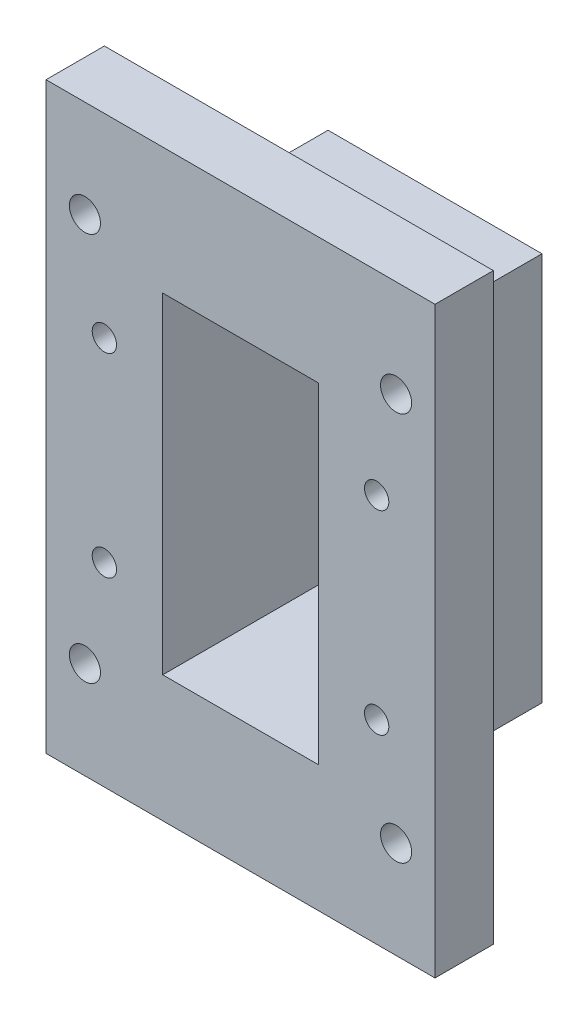
ISO-10303-21;
HEADER;
FILE_DESCRIPTION(('STEP AP214'),'2;1');
FILE_NAME('part.step','',(''),(''),'','','');
FILE_SCHEMA(('AUTOMOTIVE_DESIGN { 1 0 10303 214 1 1 1 1 }'));
ENDSEC;
DATA;
#1=APPLICATION_CONTEXT('core data for automotive mechanical design processes');
#2=APPLICATION_PROTOCOL_DEFINITION('international standard','automotive_design',2000,#1);
#3=PRODUCT_CONTEXT('',#1,'mechanical');
#4=PRODUCT('Part','Part','',(#3));
#5=PRODUCT_RELATED_PRODUCT_CATEGORY('part','',(#4));
#6=PRODUCT_DEFINITION_FORMATION('','',#4);
#7=PRODUCT_DEFINITION_CONTEXT('part definition',#1,'design');
#8=PRODUCT_DEFINITION('design','',#6,#7);
#9=PRODUCT_DEFINITION_SHAPE('','',#8);
#10=(LENGTH_UNIT() NAMED_UNIT(*) SI_UNIT(.MILLI.,.METRE.));
#11=(NAMED_UNIT(*) PLANE_ANGLE_UNIT() SI_UNIT($,.RADIAN.));
#12=(NAMED_UNIT(*) SI_UNIT($,.STERADIAN.) SOLID_ANGLE_UNIT());
#13=UNCERTAINTY_MEASURE_WITH_UNIT(LENGTH_MEASURE(1.E-05),#10,'distance_accuracy_value','');
#14=(GEOMETRIC_REPRESENTATION_CONTEXT(3) GLOBAL_UNCERTAINTY_ASSIGNED_CONTEXT((#13)) GLOBAL_UNIT_ASSIGNED_CONTEXT((#10,
#11,#12)) REPRESENTATION_CONTEXT('',''));
#15=CARTESIAN_POINT('',(0.,0.,0.));
#16=DIRECTION('',(0.,0.,1.));
#17=DIRECTION('',(1.,0.,0.));
#18=AXIS2_PLACEMENT_3D('',#15,#16,#17);
#19=CARTESIAN_POINT('',(0.,0.,6.));
#20=DIRECTION('',(0.,0.,-1.));
#21=DIRECTION('',(-1.,0.,0.));
#22=AXIS2_PLACEMENT_3D('',#19,#20,#21);
#23=PLANE('',#22);
#24=CARTESIAN_POINT('',(6.00000000000001,20.,6.));
#25=DIRECTION('',(0.,0.,1.));
#26=DIRECTION('',(1.,0.,0.));
#27=AXIS2_PLACEMENT_3D('',#24,#25,#26);
#28=CIRCLE('',#27,1.25);
#29=CARTESIAN_POINT('',(7.25000000000001,20.,6.));
#30=VERTEX_POINT('',#29);
#31=EDGE_CURVE('E406',#30,#30,#28,.T.);
#32=ORIENTED_EDGE('',*,*,#31,.F.);
#33=EDGE_LOOP('',(#32));
#34=FACE_BOUND('',#33,.T.);
#35=CARTESIAN_POINT('',(34.,20.,6.));
#36=DIRECTION('',(0.,0.,1.));
#37=DIRECTION('',(1.,0.,0.));
#38=AXIS2_PLACEMENT_3D('',#35,#36,#37);
#39=CIRCLE('',#38,1.25);
#40=CARTESIAN_POINT('',(35.25,20.,6.));
#41=VERTEX_POINT('',#40);
#42=EDGE_CURVE('E418',#41,#41,#39,.T.);
#43=ORIENTED_EDGE('',*,*,#42,.F.);
#44=EDGE_LOOP('',(#43));
#45=FACE_BOUND('',#44,.T.);
#46=DIRECTION('',(0.,-1.,0.));
#47=VECTOR('',#46,1.);
#48=CARTESIAN_POINT('',(0.,0.,6.));
#49=LINE('',#48,#47);
#50=CARTESIAN_POINT('',(0.,60.,6.));
#51=VERTEX_POINT('',#50);
#52=CARTESIAN_POINT('',(0.,0.,6.));
#53=VERTEX_POINT('',#52);
#54=EDGE_CURVE('E276',#51,#53,#49,.T.);
#55=ORIENTED_EDGE('',*,*,#54,.T.);
#56=DIRECTION('',(1.,0.,0.));
#57=VECTOR('',#56,1.);
#58=CARTESIAN_POINT('',(0.,0.,6.));
#59=LINE('',#58,#57);
#60=CARTESIAN_POINT('',(40.,0.,6.));
#61=VERTEX_POINT('',#60);
#62=EDGE_CURVE('E97',#53,#61,#59,.T.);
#63=ORIENTED_EDGE('',*,*,#62,.T.);
#64=DIRECTION('',(0.,1.,0.));
#65=VECTOR('',#64,1.);
#66=CARTESIAN_POINT('',(40.,0.,6.));
#67=LINE('',#66,#65);
#68=CARTESIAN_POINT('',(40.,60.,6.));
#69=VERTEX_POINT('',#68);
#70=EDGE_CURVE('E281',#61,#69,#67,.T.);
#71=ORIENTED_EDGE('',*,*,#70,.T.);
#72=DIRECTION('',(-1.,0.,0.));
#73=VECTOR('',#72,1.);
#74=CARTESIAN_POINT('',(0.,60.,6.));
#75=LINE('',#74,#73);
#76=EDGE_CURVE('E69',#69,#51,#75,.T.);
#77=ORIENTED_EDGE('',*,*,#76,.T.);
#78=EDGE_LOOP('',(#55,#63,#71,#77));
#79=FACE_BOUND('',#78,.T.);
#80=CARTESIAN_POINT('',(4.00000000000042,10.,6.));
#81=DIRECTION('',(0.,0.,1.));
#82=DIRECTION('',(1.,0.,0.));
#83=AXIS2_PLACEMENT_3D('',#80,#81,#82);
#84=CIRCLE('',#83,1.6);
#85=CARTESIAN_POINT('',(5.60000000000042,10.,6.));
#86=VERTEX_POINT('',#85);
#87=EDGE_CURVE('E267',#86,#86,#84,.T.);
#88=ORIENTED_EDGE('',*,*,#87,.F.);
#89=EDGE_LOOP('',(#88));
#90=FACE_BOUND('',#89,.T.);
#91=CARTESIAN_POINT('',(36.000000000001,10.,6.));
#92=DIRECTION('',(0.,0.,1.));
#93=DIRECTION('',(1.,0.,0.));
#94=AXIS2_PLACEMENT_3D('',#91,#92,#93);
#95=CIRCLE('',#94,1.6);
#96=CARTESIAN_POINT('',(37.600000000001,10.,6.));
#97=VERTEX_POINT('',#96);
#98=EDGE_CURVE('E259',#97,#97,#95,.T.);
#99=ORIENTED_EDGE('',*,*,#98,.F.);
#100=EDGE_LOOP('',(#99));
#101=FACE_BOUND('',#100,.T.);
#102=CARTESIAN_POINT('',(36.,50.,6.));
#103=DIRECTION('',(0.,0.,1.));
#104=DIRECTION('',(1.,0.,0.));
#105=AXIS2_PLACEMENT_3D('',#102,#103,#104);
#106=CIRCLE('',#105,1.6);
#107=CARTESIAN_POINT('',(37.6,50.,6.));
#108=VERTEX_POINT('',#107);
#109=EDGE_CURVE('E251',#108,#108,#106,.T.);
#110=ORIENTED_EDGE('',*,*,#109,.F.);
#111=EDGE_LOOP('',(#110));
#112=FACE_BOUND('',#111,.T.);
#113=CARTESIAN_POINT('',(4.,50.,6.));
#114=DIRECTION('',(0.,0.,1.));
#115=DIRECTION('',(1.,0.,0.));
#116=AXIS2_PLACEMENT_3D('',#113,#114,#115);
#117=CIRCLE('',#116,1.6);
#118=CARTESIAN_POINT('',(5.6,50.,6.));
#119=VERTEX_POINT('',#118);
#120=EDGE_CURVE('E243',#119,#119,#117,.T.);
#121=ORIENTED_EDGE('',*,*,#120,.F.);
#122=EDGE_LOOP('',(#121));
#123=FACE_BOUND('',#122,.T.);
#124=DIRECTION('',(-1.,0.,0.));
#125=VECTOR('',#124,1.);
#126=CARTESIAN_POINT('',(12.,13.,6.));
#127=LINE('',#126,#125);
#128=CARTESIAN_POINT('',(28.,13.,6.));
#129=VERTEX_POINT('',#128);
#130=CARTESIAN_POINT('',(12.,13.,6.));
#131=VERTEX_POINT('',#130);
#132=EDGE_CURVE('E157',#129,#131,#127,.T.);
#133=ORIENTED_EDGE('',*,*,#132,.T.);
#134=DIRECTION('',(0.,1.,0.));
#135=VECTOR('',#134,1.);
#136=CARTESIAN_POINT('',(12.,47.,6.));
#137=LINE('',#136,#135);
#138=CARTESIAN_POINT('',(12.,47.,6.));
#139=VERTEX_POINT('',#138);
#140=EDGE_CURVE('E181',#131,#139,#137,.T.);
#141=ORIENTED_EDGE('',*,*,#140,.T.);
#142=DIRECTION('',(1.,0.,0.));
#143=VECTOR('',#142,1.);
#144=CARTESIAN_POINT('',(28.,47.,6.));
#145=LINE('',#144,#143);
#146=CARTESIAN_POINT('',(28.,47.,6.));
#147=VERTEX_POINT('',#146);
#148=EDGE_CURVE('E163',#139,#147,#145,.T.);
#149=ORIENTED_EDGE('',*,*,#148,.T.);
#150=DIRECTION('',(0.,-1.,0.));
#151=VECTOR('',#150,1.);
#152=CARTESIAN_POINT('',(28.,13.,6.));
#153=LINE('',#152,#151);
#154=EDGE_CURVE('E187',#147,#129,#153,.T.);
#155=ORIENTED_EDGE('',*,*,#154,.T.);
#156=EDGE_LOOP('',(#133,#141,#149,#155));
#157=FACE_BOUND('',#156,.T.);
#158=CARTESIAN_POINT('',(34.,40.,6.));
#159=DIRECTION('',(0.,0.,1.));
#160=DIRECTION('',(1.,0.,0.));
#161=AXIS2_PLACEMENT_3D('',#158,#159,#160);
#162=CIRCLE('',#161,1.25);
#163=CARTESIAN_POINT('',(35.25,40.,6.));
#164=VERTEX_POINT('',#163);
#165=EDGE_CURVE('E426',#164,#164,#162,.T.);
#166=ORIENTED_EDGE('',*,*,#165,.F.);
#167=EDGE_LOOP('',(#166));
#168=FACE_BOUND('',#167,.T.);
#169=CARTESIAN_POINT('',(6.,40.,6.));
#170=DIRECTION('',(0.,0.,1.));
#171=DIRECTION('',(1.,0.,0.));
#172=AXIS2_PLACEMENT_3D('',#169,#170,#171);
#173=CIRCLE('',#172,1.25);
#174=CARTESIAN_POINT('',(7.25,40.,6.));
#175=VERTEX_POINT('',#174);
#176=EDGE_CURVE('E401',#175,#175,#173,.T.);
#177=ORIENTED_EDGE('',*,*,#176,.F.);
#178=EDGE_LOOP('',(#177));
#179=FACE_BOUND('',#178,.T.);
#180=ADVANCED_FACE('F44',(#34,#45,#79,#90,#101,#112,#123,#157,#168,#179),#23,.F.);
#181=CARTESIAN_POINT('',(0.,0.,6.));
#182=DIRECTION('',(1.,0.,0.));
#183=DIRECTION('',(0.,0.,-1.));
#184=AXIS2_PLACEMENT_3D('',#181,#182,#183);
#185=PLANE('',#184);
#186=DIRECTION('',(0.,-1.,0.));
#187=VECTOR('',#186,1.);
#188=CARTESIAN_POINT('',(0.,0.,0.));
#189=LINE('',#188,#187);
#190=CARTESIAN_POINT('',(0.,60.,0.));
#191=VERTEX_POINT('',#190);
#192=CARTESIAN_POINT('',(0.,0.,0.));
#193=VERTEX_POINT('',#192);
#194=EDGE_CURVE('E275',#191,#193,#189,.T.);
#195=ORIENTED_EDGE('',*,*,#194,.T.);
#196=DIRECTION('',(0.,0.,-1.));
#197=VECTOR('',#196,1.);
#198=CARTESIAN_POINT('',(0.,0.,6.));
#199=LINE('',#198,#197);
#200=EDGE_CURVE('E11',#53,#193,#199,.T.);
#201=ORIENTED_EDGE('',*,*,#200,.F.);
#202=ORIENTED_EDGE('',*,*,#54,.F.);
#203=DIRECTION('',(0.,0.,-1.));
#204=VECTOR('',#203,1.);
#205=CARTESIAN_POINT('',(0.,60.,6.));
#206=LINE('',#205,#204);
#207=EDGE_CURVE('E286',#51,#191,#206,.T.);
#208=ORIENTED_EDGE('',*,*,#207,.T.);
#209=EDGE_LOOP('',(#195,#201,#202,#208));
#210=FACE_BOUND('',#209,.T.);
#211=ADVANCED_FACE('F46',(#210),#185,.F.);
#212=CARTESIAN_POINT('',(0.,0.,6.));
#213=DIRECTION('',(0.,1.,0.));
#214=DIRECTION('',(0.,0.,1.));
#215=AXIS2_PLACEMENT_3D('',#212,#213,#214);
#216=PLANE('',#215);
#217=DIRECTION('',(1.,0.,0.));
#218=VECTOR('',#217,1.);
#219=CARTESIAN_POINT('',(0.,0.,0.));
#220=LINE('',#219,#218);
#221=CARTESIAN_POINT('',(40.,0.,0.));
#222=VERTEX_POINT('',#221);
#223=EDGE_CURVE('E290',#193,#222,#220,.T.);
#224=ORIENTED_EDGE('',*,*,#223,.T.);
#225=DIRECTION('',(0.,0.,-1.));
#226=VECTOR('',#225,1.);
#227=CARTESIAN_POINT('',(40.,0.,6.));
#228=LINE('',#227,#226);
#229=EDGE_CURVE('E53',#61,#222,#228,.T.);
#230=ORIENTED_EDGE('',*,*,#229,.F.);
#231=ORIENTED_EDGE('',*,*,#62,.F.);
#232=ORIENTED_EDGE('',*,*,#200,.T.);
#233=EDGE_LOOP('',(#224,#230,#231,#232));
#234=FACE_BOUND('',#233,.T.);
#235=ADVANCED_FACE('F326',(#234),#216,.F.);
#236=CARTESIAN_POINT('',(40.,0.,6.));
#237=DIRECTION('',(-1.,0.,0.));
#238=DIRECTION('',(0.,0.,1.));
#239=AXIS2_PLACEMENT_3D('',#236,#237,#238);
#240=PLANE('',#239);
#241=DIRECTION('',(0.,1.,0.));
#242=VECTOR('',#241,1.);
#243=CARTESIAN_POINT('',(40.,0.,0.));
#244=LINE('',#243,#242);
#245=CARTESIAN_POINT('',(40.,60.,0.));
#246=VERTEX_POINT('',#245);
#247=EDGE_CURVE('E293',#222,#246,#244,.T.);
#248=ORIENTED_EDGE('',*,*,#247,.T.);
#249=DIRECTION('',(0.,0.,-1.));
#250=VECTOR('',#249,1.);
#251=CARTESIAN_POINT('',(40.,60.,6.));
#252=LINE('',#251,#250);
#253=EDGE_CURVE('E300',#69,#246,#252,.T.);
#254=ORIENTED_EDGE('',*,*,#253,.F.);
#255=ORIENTED_EDGE('',*,*,#70,.F.);
#256=ORIENTED_EDGE('',*,*,#229,.T.);
#257=EDGE_LOOP('',(#248,#254,#255,#256));
#258=FACE_BOUND('',#257,.T.);
#259=ADVANCED_FACE('F307',(#258),#240,.F.);
#260=CARTESIAN_POINT('',(0.,60.,6.));
#261=DIRECTION('',(0.,-1.,0.));
#262=DIRECTION('',(0.,0.,-1.));
#263=AXIS2_PLACEMENT_3D('',#260,#261,#262);
#264=PLANE('',#263);
#265=DIRECTION('',(-1.,0.,0.));
#266=VECTOR('',#265,1.);
#267=CARTESIAN_POINT('',(0.,60.,0.));
#268=LINE('',#267,#266);
#269=EDGE_CURVE('E90',#246,#191,#268,.T.);
#270=ORIENTED_EDGE('',*,*,#269,.T.);
#271=ORIENTED_EDGE('',*,*,#207,.F.);
#272=ORIENTED_EDGE('',*,*,#76,.F.);
#273=ORIENTED_EDGE('',*,*,#253,.T.);
#274=EDGE_LOOP('',(#270,#271,#272,#273));
#275=FACE_BOUND('',#274,.T.);
#276=ADVANCED_FACE('F315',(#275),#264,.F.);
#277=CARTESIAN_POINT('',(0.,0.,0.));
#278=DIRECTION('',(0.,0.,-1.));
#279=DIRECTION('',(-1.,0.,0.));
#280=AXIS2_PLACEMENT_3D('',#277,#278,#279);
#281=PLANE('',#280);
#282=CARTESIAN_POINT('',(6.,40.,0.));
#283=DIRECTION('',(0.,0.,-1.));
#284=DIRECTION('',(-1.,0.,0.));
#285=AXIS2_PLACEMENT_3D('',#282,#283,#284);
#286=CIRCLE('',#285,1.25);
#287=CARTESIAN_POINT('',(4.75,40.,0.));
#288=VERTEX_POINT('',#287);
#289=EDGE_CURVE('E404',#288,#288,#286,.T.);
#290=ORIENTED_EDGE('',*,*,#289,.F.);
#291=EDGE_LOOP('',(#290));
#292=FACE_BOUND('',#291,.T.);
#293=CARTESIAN_POINT('',(6.00000000000001,20.,0.));
#294=DIRECTION('',(0.,0.,-1.));
#295=DIRECTION('',(-1.,0.,0.));
#296=AXIS2_PLACEMENT_3D('',#293,#294,#295);
#297=CIRCLE('',#296,1.25);
#298=CARTESIAN_POINT('',(4.75000000000001,20.,0.));
#299=VERTEX_POINT('',#298);
#300=EDGE_CURVE('E411',#299,#299,#297,.T.);
#301=ORIENTED_EDGE('',*,*,#300,.F.);
#302=EDGE_LOOP('',(#301));
#303=FACE_BOUND('',#302,.T.);
#304=CARTESIAN_POINT('',(34.,20.,0.));
#305=DIRECTION('',(0.,0.,-1.));
#306=DIRECTION('',(-1.,0.,0.));
#307=AXIS2_PLACEMENT_3D('',#304,#305,#306);
#308=CIRCLE('',#307,1.25);
#309=CARTESIAN_POINT('',(32.75,20.,0.));
#310=VERTEX_POINT('',#309);
#311=EDGE_CURVE('E422',#310,#310,#308,.T.);
#312=ORIENTED_EDGE('',*,*,#311,.F.);
#313=EDGE_LOOP('',(#312));
#314=FACE_BOUND('',#313,.T.);
#315=CARTESIAN_POINT('',(34.,40.,0.));
#316=DIRECTION('',(0.,0.,-1.));
#317=DIRECTION('',(-1.,0.,0.));
#318=AXIS2_PLACEMENT_3D('',#315,#316,#317);
#319=CIRCLE('',#318,1.25);
#320=CARTESIAN_POINT('',(32.75,40.,0.));
#321=VERTEX_POINT('',#320);
#322=EDGE_CURVE('E184',#321,#321,#319,.T.);
#323=ORIENTED_EDGE('',*,*,#322,.F.);
#324=EDGE_LOOP('',(#323));
#325=FACE_BOUND('',#324,.T.);
#326=DIRECTION('',(0.,-1.,0.));
#327=VECTOR('',#326,1.);
#328=CARTESIAN_POINT('',(9.00000000000001,50.,0.));
#329=LINE('',#328,#327);
#330=CARTESIAN_POINT('',(9.00000000000001,50.,0.));
#331=VERTEX_POINT('',#330);
#332=CARTESIAN_POINT('',(9.00000000000001,10.,0.));
#333=VERTEX_POINT('',#332);
#334=EDGE_CURVE('E227',#331,#333,#329,.T.);
#335=ORIENTED_EDGE('',*,*,#334,.T.);
#336=DIRECTION('',(1.,0.,0.));
#337=VECTOR('',#336,1.);
#338=CARTESIAN_POINT('',(9.00000000000001,10.,0.));
#339=LINE('',#338,#337);
#340=CARTESIAN_POINT('',(31.,10.,0.));
#341=VERTEX_POINT('',#340);
#342=EDGE_CURVE('E231',#333,#341,#339,.T.);
#343=ORIENTED_EDGE('',*,*,#342,.T.);
#344=DIRECTION('',(0.,1.,0.));
#345=VECTOR('',#344,1.);
#346=CARTESIAN_POINT('',(31.,50.,0.));
#347=LINE('',#346,#345);
#348=CARTESIAN_POINT('',(31.,50.,0.));
#349=VERTEX_POINT('',#348);
#350=EDGE_CURVE('E235',#341,#349,#347,.T.);
#351=ORIENTED_EDGE('',*,*,#350,.T.);
#352=DIRECTION('',(-1.,0.,0.));
#353=VECTOR('',#352,1.);
#354=CARTESIAN_POINT('',(9.00000000000001,50.,0.));
#355=LINE('',#354,#353);
#356=EDGE_CURVE('E239',#349,#331,#355,.T.);
#357=ORIENTED_EDGE('',*,*,#356,.T.);
#358=EDGE_LOOP('',(#335,#343,#351,#357));
#359=FACE_BOUND('',#358,.T.);
#360=CARTESIAN_POINT('',(4.,50.,0.));
#361=DIRECTION('',(0.,0.,-1.));
#362=DIRECTION('',(-1.,0.,0.));
#363=AXIS2_PLACEMENT_3D('',#360,#361,#362);
#364=CIRCLE('',#363,1.6);
#365=CARTESIAN_POINT('',(2.4,50.,0.));
#366=VERTEX_POINT('',#365);
#367=EDGE_CURVE('E247',#366,#366,#364,.T.);
#368=ORIENTED_EDGE('',*,*,#367,.F.);
#369=EDGE_LOOP('',(#368));
#370=FACE_BOUND('',#369,.T.);
#371=CARTESIAN_POINT('',(36.,50.,0.));
#372=DIRECTION('',(0.,0.,-1.));
#373=DIRECTION('',(-1.,0.,0.));
#374=AXIS2_PLACEMENT_3D('',#371,#372,#373);
#375=CIRCLE('',#374,1.6);
#376=CARTESIAN_POINT('',(34.4,50.,0.));
#377=VERTEX_POINT('',#376);
#378=EDGE_CURVE('E255',#377,#377,#375,.T.);
#379=ORIENTED_EDGE('',*,*,#378,.F.);
#380=EDGE_LOOP('',(#379));
#381=FACE_BOUND('',#380,.T.);
#382=CARTESIAN_POINT('',(36.000000000001,10.,0.));
#383=DIRECTION('',(0.,0.,-1.));
#384=DIRECTION('',(-1.,0.,0.));
#385=AXIS2_PLACEMENT_3D('',#382,#383,#384);
#386=CIRCLE('',#385,1.6);
#387=CARTESIAN_POINT('',(34.400000000001,10.,0.));
#388=VERTEX_POINT('',#387);
#389=EDGE_CURVE('E263',#388,#388,#386,.T.);
#390=ORIENTED_EDGE('',*,*,#389,.F.);
#391=EDGE_LOOP('',(#390));
#392=FACE_BOUND('',#391,.T.);
#393=CARTESIAN_POINT('',(4.00000000000042,10.,0.));
#394=DIRECTION('',(0.,0.,-1.));
#395=DIRECTION('',(-1.,0.,0.));
#396=AXIS2_PLACEMENT_3D('',#393,#394,#395);
#397=CIRCLE('',#396,1.6);
#398=CARTESIAN_POINT('',(2.40000000000042,10.,0.));
#399=VERTEX_POINT('',#398);
#400=EDGE_CURVE('E271',#399,#399,#397,.T.);
#401=ORIENTED_EDGE('',*,*,#400,.F.);
#402=EDGE_LOOP('',(#401));
#403=FACE_BOUND('',#402,.T.);
#404=ORIENTED_EDGE('',*,*,#194,.F.);
#405=ORIENTED_EDGE('',*,*,#269,.F.);
#406=ORIENTED_EDGE('',*,*,#247,.F.);
#407=ORIENTED_EDGE('',*,*,#223,.F.);
#408=EDGE_LOOP('',(#404,#405,#406,#407));
#409=FACE_BOUND('',#408,.T.);
#410=ADVANCED_FACE('F311',(#292,#303,#314,#325,#359,#370,#381,#392,#403,#409),#281,.T.);
#411=CARTESIAN_POINT('',(4.00000000000042,10.,6.));
#412=DIRECTION('',(0.,0.,1.));
#413=DIRECTION('',(1.,0.,0.));
#414=AXIS2_PLACEMENT_3D('',#411,#412,#413);
#415=CYLINDRICAL_SURFACE('',#414,1.6);
#416=ORIENTED_EDGE('',*,*,#87,.T.);
#417=EDGE_LOOP('',(#416));
#418=FACE_BOUND('',#417,.T.);
#419=ORIENTED_EDGE('',*,*,#400,.T.);
#420=EDGE_LOOP('',(#419));
#421=FACE_BOUND('',#420,.T.);
#422=ADVANCED_FACE('F323',(#418,#421),#415,.F.);
#423=CARTESIAN_POINT('',(36.000000000001,10.,6.));
#424=DIRECTION('',(0.,0.,1.));
#425=DIRECTION('',(1.,0.,0.));
#426=AXIS2_PLACEMENT_3D('',#423,#424,#425);
#427=CYLINDRICAL_SURFACE('',#426,1.6);
#428=ORIENTED_EDGE('',*,*,#98,.T.);
#429=EDGE_LOOP('',(#428));
#430=FACE_BOUND('',#429,.T.);
#431=ORIENTED_EDGE('',*,*,#389,.T.);
#432=EDGE_LOOP('',(#431));
#433=FACE_BOUND('',#432,.T.);
#434=ADVANCED_FACE('F339',(#430,#433),#427,.F.);
#435=CARTESIAN_POINT('',(36.,50.,6.));
#436=DIRECTION('',(0.,0.,1.));
#437=DIRECTION('',(1.,0.,0.));
#438=AXIS2_PLACEMENT_3D('',#435,#436,#437);
#439=CYLINDRICAL_SURFACE('',#438,1.6);
#440=ORIENTED_EDGE('',*,*,#109,.T.);
#441=EDGE_LOOP('',(#440));
#442=FACE_BOUND('',#441,.T.);
#443=ORIENTED_EDGE('',*,*,#378,.T.);
#444=EDGE_LOOP('',(#443));
#445=FACE_BOUND('',#444,.T.);
#446=ADVANCED_FACE('F343',(#442,#445),#439,.F.);
#447=CARTESIAN_POINT('',(4.,50.,6.));
#448=DIRECTION('',(0.,0.,1.));
#449=DIRECTION('',(1.,0.,0.));
#450=AXIS2_PLACEMENT_3D('',#447,#448,#449);
#451=CYLINDRICAL_SURFACE('',#450,1.6);
#452=ORIENTED_EDGE('',*,*,#120,.T.);
#453=EDGE_LOOP('',(#452));
#454=FACE_BOUND('',#453,.T.);
#455=ORIENTED_EDGE('',*,*,#367,.T.);
#456=EDGE_LOOP('',(#455));
#457=FACE_BOUND('',#456,.T.);
#458=ADVANCED_FACE('F347',(#454,#457),#451,.F.);
#459=CARTESIAN_POINT('',(0.,0.,-14.));
#460=DIRECTION('',(0.,0.,1.));
#461=DIRECTION('',(1.,0.,0.));
#462=AXIS2_PLACEMENT_3D('',#459,#460,#461);
#463=PLANE('',#462);
#464=DIRECTION('',(0.,1.,0.));
#465=VECTOR('',#464,1.);
#466=CARTESIAN_POINT('',(9.00000000000001,50.,-14.));
#467=LINE('',#466,#465);
#468=CARTESIAN_POINT('',(9.00000000000001,10.,-14.));
#469=VERTEX_POINT('',#468);
#470=CARTESIAN_POINT('',(9.00000000000001,50.,-14.));
#471=VERTEX_POINT('',#470);
#472=EDGE_CURVE('E165',#469,#471,#467,.T.);
#473=ORIENTED_EDGE('',*,*,#472,.T.);
#474=DIRECTION('',(1.,0.,0.));
#475=VECTOR('',#474,1.);
#476=CARTESIAN_POINT('',(31.,50.,-14.));
#477=LINE('',#476,#475);
#478=CARTESIAN_POINT('',(31.,50.,-14.));
#479=VERTEX_POINT('',#478);
#480=EDGE_CURVE('E204',#471,#479,#477,.T.);
#481=ORIENTED_EDGE('',*,*,#480,.T.);
#482=DIRECTION('',(0.,-1.,0.));
#483=VECTOR('',#482,1.);
#484=CARTESIAN_POINT('',(31.,10.,-14.));
#485=LINE('',#484,#483);
#486=CARTESIAN_POINT('',(31.,10.,-14.));
#487=VERTEX_POINT('',#486);
#488=EDGE_CURVE('E207',#479,#487,#485,.T.);
#489=ORIENTED_EDGE('',*,*,#488,.T.);
#490=DIRECTION('',(-1.,0.,0.));
#491=VECTOR('',#490,1.);
#492=CARTESIAN_POINT('',(9.00000000000001,10.,-14.));
#493=LINE('',#492,#491);
#494=EDGE_CURVE('E210',#487,#469,#493,.T.);
#495=ORIENTED_EDGE('',*,*,#494,.T.);
#496=EDGE_LOOP('',(#473,#481,#489,#495));
#497=FACE_BOUND('',#496,.T.);
#498=DIRECTION('',(0.,1.,0.));
#499=VECTOR('',#498,1.);
#500=CARTESIAN_POINT('',(12.,47.,-14.));
#501=LINE('',#500,#499);
#502=CARTESIAN_POINT('',(12.,13.,-14.));
#503=VERTEX_POINT('',#502);
#504=CARTESIAN_POINT('',(12.,47.,-14.));
#505=VERTEX_POINT('',#504);
#506=EDGE_CURVE('E145',#503,#505,#501,.T.);
#507=ORIENTED_EDGE('',*,*,#506,.F.);
#508=DIRECTION('',(-1.,0.,0.));
#509=VECTOR('',#508,1.);
#510=CARTESIAN_POINT('',(12.,13.,-14.));
#511=LINE('',#510,#509);
#512=CARTESIAN_POINT('',(28.,13.,-14.));
#513=VERTEX_POINT('',#512);
#514=EDGE_CURVE('E175',#513,#503,#511,.T.);
#515=ORIENTED_EDGE('',*,*,#514,.F.);
#516=DIRECTION('',(0.,-1.,0.));
#517=VECTOR('',#516,1.);
#518=CARTESIAN_POINT('',(28.,13.,-14.));
#519=LINE('',#518,#517);
#520=CARTESIAN_POINT('',(28.,47.,-14.));
#521=VERTEX_POINT('',#520);
#522=EDGE_CURVE('E171',#521,#513,#519,.T.);
#523=ORIENTED_EDGE('',*,*,#522,.F.);
#524=DIRECTION('',(1.,0.,0.));
#525=VECTOR('',#524,1.);
#526=CARTESIAN_POINT('',(28.,47.,-14.));
#527=LINE('',#526,#525);
#528=EDGE_CURVE('E156',#505,#521,#527,.T.);
#529=ORIENTED_EDGE('',*,*,#528,.F.);
#530=EDGE_LOOP('',(#507,#515,#523,#529));
#531=FACE_BOUND('',#530,.T.);
#532=ADVANCED_FACE('F169',(#497,#531),#463,.F.);
#533=CARTESIAN_POINT('',(9.00000000000001,50.,-14.));
#534=DIRECTION('',(1.,0.,0.));
#535=DIRECTION('',(0.,1.,0.));
#536=AXIS2_PLACEMENT_3D('',#533,#534,#535);
#537=PLANE('',#536);
#538=ORIENTED_EDGE('',*,*,#334,.F.);
#539=DIRECTION('',(0.,0.,1.));
#540=VECTOR('',#539,1.);
#541=CARTESIAN_POINT('',(9.00000000000001,50.,-14.));
#542=LINE('',#541,#540);
#543=EDGE_CURVE('E223',#471,#331,#542,.T.);
#544=ORIENTED_EDGE('',*,*,#543,.F.);
#545=ORIENTED_EDGE('',*,*,#472,.F.);
#546=DIRECTION('',(0.,0.,1.));
#547=VECTOR('',#546,1.);
#548=CARTESIAN_POINT('',(9.00000000000001,10.,-14.));
#549=LINE('',#548,#547);
#550=EDGE_CURVE('E213',#469,#333,#549,.T.);
#551=ORIENTED_EDGE('',*,*,#550,.T.);
#552=EDGE_LOOP('',(#538,#544,#545,#551));
#553=FACE_BOUND('',#552,.T.);
#554=ADVANCED_FACE('F352',(#553),#537,.F.);
#555=CARTESIAN_POINT('',(31.,50.,-14.));
#556=DIRECTION('',(0.,-1.,0.));
#557=DIRECTION('',(0.,0.,-1.));
#558=AXIS2_PLACEMENT_3D('',#555,#556,#557);
#559=PLANE('',#558);
#560=ORIENTED_EDGE('',*,*,#356,.F.);
#561=DIRECTION('',(0.,0.,1.));
#562=VECTOR('',#561,1.);
#563=CARTESIAN_POINT('',(31.,50.,-14.));
#564=LINE('',#563,#562);
#565=EDGE_CURVE('E219',#479,#349,#564,.T.);
#566=ORIENTED_EDGE('',*,*,#565,.F.);
#567=ORIENTED_EDGE('',*,*,#480,.F.);
#568=ORIENTED_EDGE('',*,*,#543,.T.);
#569=EDGE_LOOP('',(#560,#566,#567,#568));
#570=FACE_BOUND('',#569,.T.);
#571=ADVANCED_FACE('F355',(#570),#559,.F.);
#572=CARTESIAN_POINT('',(31.,10.,-14.));
#573=DIRECTION('',(-1.,0.,0.));
#574=DIRECTION('',(0.,-1.,0.));
#575=AXIS2_PLACEMENT_3D('',#572,#573,#574);
#576=PLANE('',#575);
#577=ORIENTED_EDGE('',*,*,#350,.F.);
#578=DIRECTION('',(0.,0.,1.));
#579=VECTOR('',#578,1.);
#580=CARTESIAN_POINT('',(31.,10.,-14.));
#581=LINE('',#580,#579);
#582=EDGE_CURVE('E60',#487,#341,#581,.T.);
#583=ORIENTED_EDGE('',*,*,#582,.F.);
#584=ORIENTED_EDGE('',*,*,#488,.F.);
#585=ORIENTED_EDGE('',*,*,#565,.T.);
#586=EDGE_LOOP('',(#577,#583,#584,#585));
#587=FACE_BOUND('',#586,.T.);
#588=ADVANCED_FACE('F359',(#587),#576,.F.);
#589=CARTESIAN_POINT('',(9.00000000000001,10.,-14.));
#590=DIRECTION('',(0.,1.,0.));
#591=DIRECTION('',(-1.,0.,0.));
#592=AXIS2_PLACEMENT_3D('',#589,#590,#591);
#593=PLANE('',#592);
#594=ORIENTED_EDGE('',*,*,#342,.F.);
#595=ORIENTED_EDGE('',*,*,#550,.F.);
#596=ORIENTED_EDGE('',*,*,#494,.F.);
#597=ORIENTED_EDGE('',*,*,#582,.T.);
#598=EDGE_LOOP('',(#594,#595,#596,#597));
#599=FACE_BOUND('',#598,.T.);
#600=ADVANCED_FACE('F363',(#599),#593,.F.);
#601=CARTESIAN_POINT('',(12.,47.,-14.));
#602=DIRECTION('',(1.,0.,0.));
#603=DIRECTION('',(0.,0.,-1.));
#604=AXIS2_PLACEMENT_3D('',#601,#602,#603);
#605=PLANE('',#604);
#606=ORIENTED_EDGE('',*,*,#140,.F.);
#607=DIRECTION('',(0.,0.,1.));
#608=VECTOR('',#607,1.);
#609=CARTESIAN_POINT('',(12.,13.,-14.));
#610=LINE('',#609,#608);
#611=EDGE_CURVE('E151',#503,#131,#610,.T.);
#612=ORIENTED_EDGE('',*,*,#611,.F.);
#613=ORIENTED_EDGE('',*,*,#506,.T.);
#614=DIRECTION('',(0.,0.,1.));
#615=VECTOR('',#614,1.);
#616=CARTESIAN_POINT('',(12.,47.,-14.));
#617=LINE('',#616,#615);
#618=EDGE_CURVE('E148',#505,#139,#617,.T.);
#619=ORIENTED_EDGE('',*,*,#618,.T.);
#620=EDGE_LOOP('',(#606,#612,#613,#619));
#621=FACE_BOUND('',#620,.T.);
#622=ADVANCED_FACE('F147',(#621),#605,.T.);
#623=CARTESIAN_POINT('',(28.,47.,-14.));
#624=DIRECTION('',(0.,-1.,0.));
#625=DIRECTION('',(0.,0.,-1.));
#626=AXIS2_PLACEMENT_3D('',#623,#624,#625);
#627=PLANE('',#626);
#628=ORIENTED_EDGE('',*,*,#148,.F.);
#629=ORIENTED_EDGE('',*,*,#618,.F.);
#630=ORIENTED_EDGE('',*,*,#528,.T.);
#631=DIRECTION('',(0.,0.,1.));
#632=VECTOR('',#631,1.);
#633=CARTESIAN_POINT('',(28.,47.,-14.));
#634=LINE('',#633,#632);
#635=EDGE_CURVE('E166',#521,#147,#634,.T.);
#636=ORIENTED_EDGE('',*,*,#635,.T.);
#637=EDGE_LOOP('',(#628,#629,#630,#636));
#638=FACE_BOUND('',#637,.T.);
#639=ADVANCED_FACE('F160',(#638),#627,.T.);
#640=CARTESIAN_POINT('',(28.,13.,-14.));
#641=DIRECTION('',(-1.,0.,0.));
#642=DIRECTION('',(0.,0.,1.));
#643=AXIS2_PLACEMENT_3D('',#640,#641,#642);
#644=PLANE('',#643);
#645=ORIENTED_EDGE('',*,*,#154,.F.);
#646=ORIENTED_EDGE('',*,*,#635,.F.);
#647=ORIENTED_EDGE('',*,*,#522,.T.);
#648=DIRECTION('',(0.,0.,1.));
#649=VECTOR('',#648,1.);
#650=CARTESIAN_POINT('',(28.,13.,-14.));
#651=LINE('',#650,#649);
#652=EDGE_CURVE('E196',#513,#129,#651,.T.);
#653=ORIENTED_EDGE('',*,*,#652,.T.);
#654=EDGE_LOOP('',(#645,#646,#647,#653));
#655=FACE_BOUND('',#654,.T.);
#656=ADVANCED_FACE('F374',(#655),#644,.T.);
#657=CARTESIAN_POINT('',(12.,13.,-14.));
#658=DIRECTION('',(0.,1.,0.));
#659=DIRECTION('',(0.,0.,1.));
#660=AXIS2_PLACEMENT_3D('',#657,#658,#659);
#661=PLANE('',#660);
#662=ORIENTED_EDGE('',*,*,#132,.F.);
#663=ORIENTED_EDGE('',*,*,#652,.F.);
#664=ORIENTED_EDGE('',*,*,#514,.T.);
#665=ORIENTED_EDGE('',*,*,#611,.T.);
#666=EDGE_LOOP('',(#662,#663,#664,#665));
#667=FACE_BOUND('',#666,.T.);
#668=ADVANCED_FACE('F377',(#667),#661,.T.);
#669=CARTESIAN_POINT('',(34.,40.,6.));
#670=DIRECTION('',(0.,0.,1.));
#671=DIRECTION('',(1.,0.,0.));
#672=AXIS2_PLACEMENT_3D('',#669,#670,#671);
#673=CYLINDRICAL_SURFACE('',#672,1.25);
#674=ORIENTED_EDGE('',*,*,#165,.T.);
#675=EDGE_LOOP('',(#674));
#676=FACE_BOUND('',#675,.T.);
#677=ORIENTED_EDGE('',*,*,#322,.T.);
#678=EDGE_LOOP('',(#677));
#679=FACE_BOUND('',#678,.T.);
#680=ADVANCED_FACE('F380',(#676,#679),#673,.F.);
#681=CARTESIAN_POINT('',(34.,20.,6.));
#682=DIRECTION('',(0.,0.,1.));
#683=DIRECTION('',(1.,0.,0.));
#684=AXIS2_PLACEMENT_3D('',#681,#682,#683);
#685=CYLINDRICAL_SURFACE('',#684,1.25);
#686=ORIENTED_EDGE('',*,*,#42,.T.);
#687=EDGE_LOOP('',(#686));
#688=FACE_BOUND('',#687,.T.);
#689=ORIENTED_EDGE('',*,*,#311,.T.);
#690=EDGE_LOOP('',(#689));
#691=FACE_BOUND('',#690,.T.);
#692=ADVANCED_FACE('F384',(#688,#691),#685,.F.);
#693=CARTESIAN_POINT('',(6.00000000000001,20.,6.));
#694=DIRECTION('',(0.,0.,1.));
#695=DIRECTION('',(1.,0.,0.));
#696=AXIS2_PLACEMENT_3D('',#693,#694,#695);
#697=CYLINDRICAL_SURFACE('',#696,1.25);
#698=ORIENTED_EDGE('',*,*,#31,.T.);
#699=EDGE_LOOP('',(#698));
#700=FACE_BOUND('',#699,.T.);
#701=ORIENTED_EDGE('',*,*,#300,.T.);
#702=EDGE_LOOP('',(#701));
#703=FACE_BOUND('',#702,.T.);
#704=ADVANCED_FACE('F388',(#700,#703),#697,.F.);
#705=CARTESIAN_POINT('',(6.,40.,6.));
#706=DIRECTION('',(0.,0.,1.));
#707=DIRECTION('',(1.,0.,0.));
#708=AXIS2_PLACEMENT_3D('',#705,#706,#707);
#709=CYLINDRICAL_SURFACE('',#708,1.25);
#710=ORIENTED_EDGE('',*,*,#176,.T.);
#711=EDGE_LOOP('',(#710));
#712=FACE_BOUND('',#711,.T.);
#713=ORIENTED_EDGE('',*,*,#289,.T.);
#714=EDGE_LOOP('',(#713));
#715=FACE_BOUND('',#714,.T.);
#716=ADVANCED_FACE('F392',(#712,#715),#709,.F.);
#717=CLOSED_SHELL('',(#180,#211,#235,#259,#276,#410,#422,#434,#446,#458,#532,#554,#571,#588,
#600,#622,#639,#656,#668,#680,#692,#704,#716));
#718=MANIFOLD_SOLID_BREP('B2',#717);
#719=ADVANCED_BREP_SHAPE_REPRESENTATION('',(#18,#718),#14);
#720=SHAPE_DEFINITION_REPRESENTATION(#9,#719);
ENDSEC;
END-ISO-10303-21;
